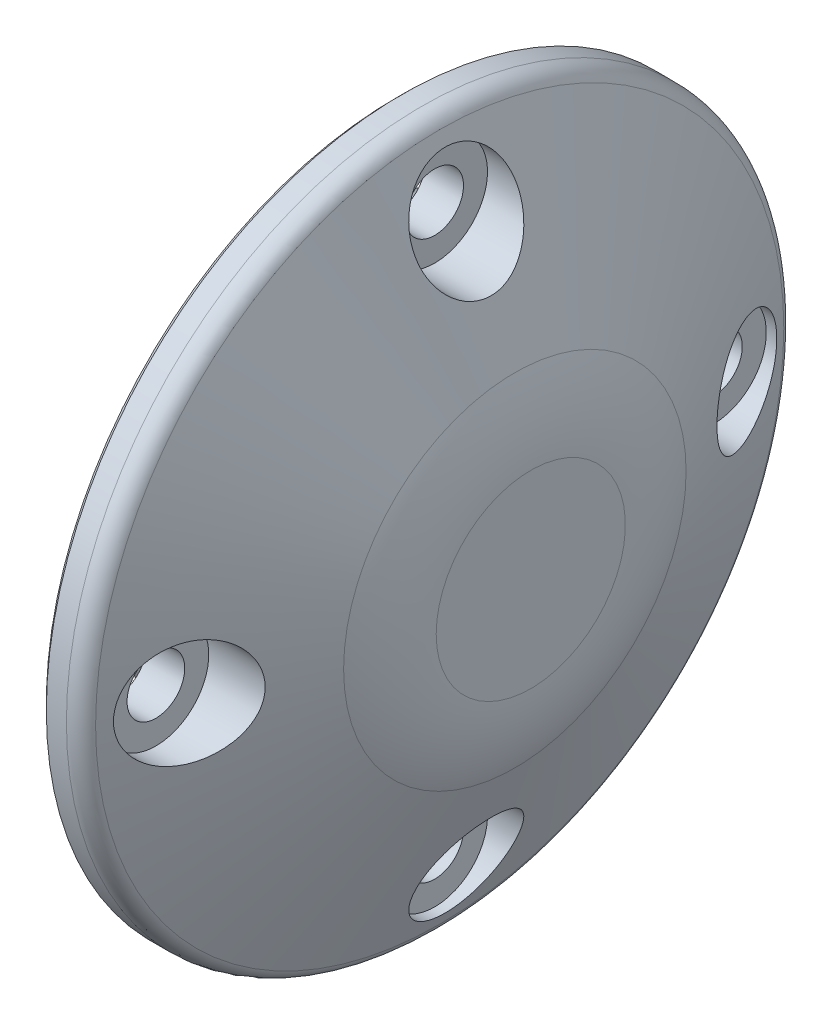
ISO-10303-21;
HEADER;
FILE_DESCRIPTION(('STEP AP214'),'2;1');
FILE_NAME('part.step','',(''),(''),'','','');
FILE_SCHEMA(('AUTOMOTIVE_DESIGN { 1 0 10303 214 1 1 1 1 }'));
ENDSEC;
DATA;
#1=APPLICATION_CONTEXT('core data for automotive mechanical design processes');
#2=APPLICATION_PROTOCOL_DEFINITION('international standard','automotive_design',2000,#1);
#3=PRODUCT_CONTEXT('',#1,'mechanical');
#4=PRODUCT('Part','Part','',(#3));
#5=PRODUCT_RELATED_PRODUCT_CATEGORY('part','',(#4));
#6=PRODUCT_DEFINITION_FORMATION('','',#4);
#7=PRODUCT_DEFINITION_CONTEXT('part definition',#1,'design');
#8=PRODUCT_DEFINITION('design','',#6,#7);
#9=PRODUCT_DEFINITION_SHAPE('','',#8);
#10=(LENGTH_UNIT() NAMED_UNIT(*) SI_UNIT(.MILLI.,.METRE.));
#11=(NAMED_UNIT(*) PLANE_ANGLE_UNIT() SI_UNIT($,.RADIAN.));
#12=(NAMED_UNIT(*) SI_UNIT($,.STERADIAN.) SOLID_ANGLE_UNIT());
#13=UNCERTAINTY_MEASURE_WITH_UNIT(LENGTH_MEASURE(1.E-05),#10,'distance_accuracy_value','');
#14=(GEOMETRIC_REPRESENTATION_CONTEXT(3) GLOBAL_UNCERTAINTY_ASSIGNED_CONTEXT((#13)) GLOBAL_UNIT_ASSIGNED_CONTEXT((#10,
#11,#12)) REPRESENTATION_CONTEXT('',''));
#15=CARTESIAN_POINT('',(0.,0.,0.));
#16=DIRECTION('',(0.,0.,1.));
#17=DIRECTION('',(1.,0.,0.));
#18=AXIS2_PLACEMENT_3D('',#15,#16,#17);
#19=CARTESIAN_POINT('',(0.,0.,0.));
#20=DIRECTION('',(-1.,0.,0.));
#21=DIRECTION('',(0.,0.,1.));
#22=AXIS2_PLACEMENT_3D('',#19,#20,#21);
#23=CYLINDRICAL_SURFACE('',#22,7.);
#24=CARTESIAN_POINT('',(-3.,0.,0.));
#25=DIRECTION('',(1.,0.,0.));
#26=DIRECTION('',(0.,0.,-1.));
#27=AXIS2_PLACEMENT_3D('',#24,#25,#26);
#28=CIRCLE('',#27,7.);
#29=CARTESIAN_POINT('',(-3.,0.,-7.));
#30=VERTEX_POINT('',#29);
#31=EDGE_CURVE('E176',#30,#30,#28,.T.);
#32=ORIENTED_EDGE('',*,*,#31,.T.);
#33=EDGE_LOOP('',(#32));
#34=FACE_BOUND('',#33,.T.);
#35=CARTESIAN_POINT('',(-10.,0.,0.));
#36=DIRECTION('',(-1.,0.,0.));
#37=DIRECTION('',(0.,0.,1.));
#38=AXIS2_PLACEMENT_3D('',#35,#36,#37);
#39=CIRCLE('',#38,7.);
#40=CARTESIAN_POINT('',(-10.,0.,7.));
#41=VERTEX_POINT('',#40);
#42=EDGE_CURVE('E181',#41,#41,#39,.T.);
#43=ORIENTED_EDGE('',*,*,#42,.T.);
#44=EDGE_LOOP('',(#43));
#45=FACE_BOUND('',#44,.T.);
#46=ADVANCED_FACE('F37',(#34,#45),#23,.F.);
#47=CARTESIAN_POINT('',(-10.,7.,0.));
#48=DIRECTION('',(1.,0.,0.));
#49=DIRECTION('',(0.,0.,-1.));
#50=AXIS2_PLACEMENT_3D('',#47,#48,#49);
#51=PLANE('',#50);
#52=CARTESIAN_POINT('',(-10.,0.,0.));
#53=DIRECTION('',(1.,0.,0.));
#54=DIRECTION('',(0.,0.,-1.));
#55=AXIS2_PLACEMENT_3D('',#52,#53,#54);
#56=CIRCLE('',#55,10.7);
#57=CARTESIAN_POINT('',(-10.,0.,-10.7));
#58=VERTEX_POINT('',#57);
#59=EDGE_CURVE('E167',#58,#58,#56,.F.);
#60=ORIENTED_EDGE('',*,*,#59,.T.);
#61=EDGE_LOOP('',(#60));
#62=FACE_BOUND('',#61,.T.);
#63=ORIENTED_EDGE('',*,*,#42,.F.);
#64=EDGE_LOOP('',(#63));
#65=FACE_BOUND('',#64,.T.);
#66=ADVANCED_FACE('F133',(#62,#65),#51,.F.);
#67=CARTESIAN_POINT('',(0.,0.,0.));
#68=DIRECTION('',(-1.,0.,0.));
#69=DIRECTION('',(0.,0.,1.));
#70=AXIS2_PLACEMENT_3D('',#67,#68,#69);
#71=CYLINDRICAL_SURFACE('',#70,11.);
#72=CARTESIAN_POINT('',(-9.7,0.,0.));
#73=DIRECTION('',(1.,0.,0.));
#74=DIRECTION('',(0.,0.,-1.));
#75=AXIS2_PLACEMENT_3D('',#72,#73,#74);
#76=CIRCLE('',#75,11.);
#77=CARTESIAN_POINT('',(-9.7,0.,-11.));
#78=VERTEX_POINT('',#77);
#79=EDGE_CURVE('E56',#78,#78,#76,.T.);
#80=ORIENTED_EDGE('',*,*,#79,.T.);
#81=EDGE_LOOP('',(#80));
#82=FACE_BOUND('',#81,.T.);
#83=CARTESIAN_POINT('',(-7.,0.,0.));
#84=DIRECTION('',(1.,0.,0.));
#85=DIRECTION('',(0.,0.,-1.));
#86=AXIS2_PLACEMENT_3D('',#83,#84,#85);
#87=CIRCLE('',#86,11.);
#88=CARTESIAN_POINT('',(-7.,0.,-11.));
#89=VERTEX_POINT('',#88);
#90=EDGE_CURVE('E171',#89,#89,#87,.F.);
#91=ORIENTED_EDGE('',*,*,#90,.T.);
#92=EDGE_LOOP('',(#91));
#93=FACE_BOUND('',#92,.T.);
#94=ADVANCED_FACE('F139',(#82,#93),#71,.T.);
#95=CARTESIAN_POINT('',(-6.,11.,0.));
#96=DIRECTION('',(1.,0.,0.));
#97=DIRECTION('',(0.,0.,-1.));
#98=AXIS2_PLACEMENT_3D('',#95,#96,#97);
#99=PLANE('',#98);
#100=CARTESIAN_POINT('',(-6.,14.5,0.));
#101=DIRECTION('',(-1.,0.,0.));
#102=DIRECTION('',(0.,0.,1.));
#103=AXIS2_PLACEMENT_3D('',#100,#101,#102);
#104=CIRCLE('',#103,1.5);
#105=CARTESIAN_POINT('',(-6.,14.5,1.5));
#106=VERTEX_POINT('',#105);
#107=EDGE_CURVE('E196',#106,#106,#104,.T.);
#108=ORIENTED_EDGE('',*,*,#107,.F.);
#109=EDGE_LOOP('',(#108));
#110=FACE_BOUND('',#109,.T.);
#111=CARTESIAN_POINT('',(-6.,4.23539569988E-13,14.5000000000004));
#112=DIRECTION('',(-1.,0.,0.));
#113=DIRECTION('',(0.,0.,1.));
#114=AXIS2_PLACEMENT_3D('',#111,#112,#113);
#115=CIRCLE('',#114,1.5);
#116=CARTESIAN_POINT('',(-6.,4.23539569988E-13,16.0000000000004));
#117=VERTEX_POINT('',#116);
#118=EDGE_CURVE('E203',#117,#117,#115,.T.);
#119=ORIENTED_EDGE('',*,*,#118,.F.);
#120=EDGE_LOOP('',(#119));
#121=FACE_BOUND('',#120,.T.);
#122=CARTESIAN_POINT('',(-6.,-14.5,8.47079139976E-13));
#123=DIRECTION('',(-1.,0.,0.));
#124=DIRECTION('',(0.,0.,1.));
#125=AXIS2_PLACEMENT_3D('',#122,#123,#124);
#126=CIRCLE('',#125,1.5);
#127=CARTESIAN_POINT('',(-6.,-14.5,1.50000000000085));
#128=VERTEX_POINT('',#127);
#129=EDGE_CURVE('E200',#128,#128,#126,.T.);
#130=ORIENTED_EDGE('',*,*,#129,.F.);
#131=EDGE_LOOP('',(#130));
#132=FACE_BOUND('',#131,.T.);
#133=CARTESIAN_POINT('',(-6.,-4.25315307846764E-13,-14.4999999999996));
#134=DIRECTION('',(-1.,0.,0.));
#135=DIRECTION('',(0.,0.,1.));
#136=AXIS2_PLACEMENT_3D('',#133,#134,#135);
#137=CIRCLE('',#136,1.5);
#138=CARTESIAN_POINT('',(-6.,-4.25315307846764E-13,-12.9999999999996));
#139=VERTEX_POINT('',#138);
#140=EDGE_CURVE('E197',#139,#139,#137,.T.);
#141=ORIENTED_EDGE('',*,*,#140,.F.);
#142=EDGE_LOOP('',(#141));
#143=FACE_BOUND('',#142,.T.);
#144=CARTESIAN_POINT('',(-6.,0.,0.));
#145=DIRECTION('',(1.,0.,0.));
#146=DIRECTION('',(0.,0.,-1.));
#147=AXIS2_PLACEMENT_3D('',#144,#145,#146);
#148=CIRCLE('',#147,18.2);
#149=CARTESIAN_POINT('',(-6.,0.,-18.2));
#150=VERTEX_POINT('',#149);
#151=EDGE_CURVE('E51',#150,#150,#148,.F.);
#152=ORIENTED_EDGE('',*,*,#151,.T.);
#153=EDGE_LOOP('',(#152));
#154=FACE_BOUND('',#153,.T.);
#155=CARTESIAN_POINT('',(-6.,0.,0.));
#156=DIRECTION('',(1.,0.,0.));
#157=DIRECTION('',(0.,0.,-1.));
#158=AXIS2_PLACEMENT_3D('',#155,#156,#157);
#159=CIRCLE('',#158,12.);
#160=CARTESIAN_POINT('',(-6.,0.,-12.));
#161=VERTEX_POINT('',#160);
#162=EDGE_CURVE('E168',#161,#161,#159,.T.);
#163=ORIENTED_EDGE('',*,*,#162,.T.);
#164=EDGE_LOOP('',(#163));
#165=FACE_BOUND('',#164,.T.);
#166=ADVANCED_FACE('F231',(#110,#121,#132,#143,#154,#165),#99,.F.);
#167=CARTESIAN_POINT('',(0.,0.,0.));
#168=DIRECTION('',(-1.,0.,0.));
#169=DIRECTION('',(0.,0.,1.));
#170=AXIS2_PLACEMENT_3D('',#167,#168,#169);
#171=CYLINDRICAL_SURFACE('',#170,18.5);
#172=CARTESIAN_POINT('',(-5.70000000000002,0.,0.));
#173=DIRECTION('',(1.,0.,0.));
#174=DIRECTION('',(0.,0.,-1.));
#175=AXIS2_PLACEMENT_3D('',#172,#173,#174);
#176=CIRCLE('',#175,18.5);
#177=CARTESIAN_POINT('',(-5.70000000000002,0.,-18.5));
#178=VERTEX_POINT('',#177);
#179=EDGE_CURVE('E10',#178,#178,#176,.T.);
#180=ORIENTED_EDGE('',*,*,#179,.T.);
#181=EDGE_LOOP('',(#180));
#182=FACE_BOUND('',#181,.T.);
#183=CARTESIAN_POINT('',(-4.65564662643343,0.,0.));
#184=DIRECTION('',(-1.,0.,0.));
#185=DIRECTION('',(0.,0.,1.));
#186=AXIS2_PLACEMENT_3D('',#183,#184,#185);
#187=CIRCLE('',#186,18.5);
#188=CARTESIAN_POINT('',(-4.65564662643343,0.,18.5));
#189=VERTEX_POINT('',#188);
#190=EDGE_CURVE('E184',#189,#189,#187,.T.);
#191=ORIENTED_EDGE('',*,*,#190,.T.);
#192=EDGE_LOOP('',(#191));
#193=FACE_BOUND('',#192,.T.);
#194=ADVANCED_FACE('F234',(#182,#193),#171,.T.);
#195=CARTESIAN_POINT('',(-4.65564662643343,0.,0.));
#196=DIRECTION('',(-1.,0.,0.));
#197=DIRECTION('',(0.,0.,1.));
#198=AXIS2_PLACEMENT_3D('',#195,#196,#197);
#199=TOROIDAL_SURFACE('',#198,17.5,0.999999999999999);
#200=ORIENTED_EDGE('',*,*,#190,.F.);
#201=EDGE_LOOP('',(#200));
#202=FACE_BOUND('',#201,.T.);
#203=CARTESIAN_POINT('',(-3.7385765701802,0.,0.));
#204=DIRECTION('',(-1.,0.,0.));
#205=DIRECTION('',(0.,0.,1.));
#206=AXIS2_PLACEMENT_3D('',#203,#204,#205);
#207=CIRCLE('',#206,17.8987261114144);
#208=CARTESIAN_POINT('',(-3.7385765701802,0.,17.8987261114144));
#209=VERTEX_POINT('',#208);
#210=EDGE_CURVE('E187',#209,#209,#207,.T.);
#211=ORIENTED_EDGE('',*,*,#210,.T.);
#212=EDGE_LOOP('',(#211));
#213=FACE_BOUND('',#212,.T.);
#214=ADVANCED_FACE('F128',(#202,#213),#199,.T.);
#215=CARTESIAN_POINT('',(0.17070056253235,0.,0.));
#216=DIRECTION('',(-1.,0.,0.));
#217=DIRECTION('',(0.,0.,1.));
#218=AXIS2_PLACEMENT_3D('',#215,#216,#217);
#219=CONICAL_SURFACE('',#218,8.90738870617559,1.16066898625341);
#220=CARTESIAN_POINT('',(-1.63010796675009,12.8610476484868,-2.20824255680728));
#221=CARTESIAN_POINT('',(-1.57165449747424,12.7400573118976,-2.11844104067019));
#222=CARTESIAN_POINT('',(-1.51548775777091,12.6256868821112,-2.01811834508152));
#223=CARTESIAN_POINT('',(-1.40990675774852,12.4135927845462,-1.79799151237397));
#224=CARTESIAN_POINT('',(-1.36049588387224,12.3158774592915,-1.67817767054178));
#225=CARTESIAN_POINT('',(-1.27069608633115,12.1403011624128,-1.42080404131312));
#226=CARTESIAN_POINT('',(-1.2303490466346,12.0625321374834,-1.28316632245381));
#227=CARTESIAN_POINT('',(-1.16157488064387,11.9310659444004,-0.994099560942523));
#228=CARTESIAN_POINT('',(-1.13313872564242,11.8773505409422,-0.842681070787273));
#229=CARTESIAN_POINT('',(-1.09216745049004,11.8002908211275,-0.543925079599131));
#230=CARTESIAN_POINT('',(-1.07850439585136,11.7747879874495,-0.397299623054259));
#231=CARTESIAN_POINT('',(-1.06407163635774,11.7478542352304,-0.101250082003507));
#232=CARTESIAN_POINT('',(-1.06329560227342,11.7464115000015,0.0481725925959655));
#233=CARTESIAN_POINT('',(-1.0742415264973,11.7668302767822,0.333414198677667));
#234=CARTESIAN_POINT('',(-1.08501512784508,11.7869234202469,0.469401739234721));
#235=CARTESIAN_POINT('',(-1.11687870842232,11.8467272098125,0.735710056453212));
#236=CARTESIAN_POINT('',(-1.13796909754057,11.8864386353535,0.8660306077396));
#237=CARTESIAN_POINT('',(-1.1896439195432,11.9846068574907,1.11987744244274));
#238=CARTESIAN_POINT('',(-1.22037729895063,12.0433582506748,1.24325860874585));
#239=CARTESIAN_POINT('',(-1.28963393469495,12.1772346542211,1.47837101883296));
#240=CARTESIAN_POINT('',(-1.32815961128904,12.252364752311,1.59009862668521));
#241=CARTESIAN_POINT('',(-1.41512401164567,12.42411333826,1.80950450976185));
#242=CARTESIAN_POINT('',(-1.46414279328872,12.522057071282,1.91591382486278));
#243=CARTESIAN_POINT('',(-1.56754021826142,12.73176581518,2.11101516053997));
#244=CARTESIAN_POINT('',(-1.62192120598543,12.843536876948,2.19969937982892));
#245=CARTESIAN_POINT('',(-1.74028614228192,13.0906141312613,2.36656759131391));
#246=CARTESIAN_POINT('',(-1.8046763490532,13.2271591241946,2.44263258262435));
#247=CARTESIAN_POINT('',(-1.93584744740343,13.5101572146572,2.57037675955239));
#248=CARTESIAN_POINT('',(-2.00262924923253,13.6566141039745,2.62204655182577));
#249=CARTESIAN_POINT('',(-2.14164028059317,13.966647498446,2.70286780032805));
#250=CARTESIAN_POINT('',(-2.21391608782391,14.1306979149761,2.73013411028564));
#251=CARTESIAN_POINT('',(-2.35722438772212,14.4615960443318,2.75473378119217));
#252=CARTESIAN_POINT('',(-2.42825666722423,14.6284442273362,2.75206205952685));
#253=CARTESIAN_POINT('',(-2.56819740009455,14.962402187595,2.71610995471977));
#254=CARTESIAN_POINT('',(-2.637065170182,15.1294860639176,2.68242392736295));
#255=CARTESIAN_POINT('',(-2.76985802473963,15.4563508000654,2.58399054991544));
#256=CARTESIAN_POINT('',(-2.83378389620299,15.616132821041,2.51924815740544));
#257=CARTESIAN_POINT('',(-2.95253160188133,15.9166944402962,2.36284487060595));
#258=CARTESIAN_POINT('',(-3.00761317621024,16.05797513128,2.27234725256631));
#259=CARTESIAN_POINT('',(-3.11003750326505,16.3233676242448,2.06545417187465));
#260=CARTESIAN_POINT('',(-3.15738348805653,16.4474865933462,1.94906957350329));
#261=CARTESIAN_POINT('',(-3.23998600089484,16.6657756932895,1.70212259174715));
#262=CARTESIAN_POINT('',(-3.27584320498476,16.7614026821969,1.5730493648872));
#263=CARTESIAN_POINT('',(-3.33849100234707,16.9294050899457,1.29859171196748));
#264=CARTESIAN_POINT('',(-3.36528564687819,17.0017908976151,1.1532146130735));
#265=CARTESIAN_POINT('',(-3.40750232889014,17.1162350408379,0.860717763057016));
#266=CARTESIAN_POINT('',(-3.42355933498126,17.1599825771937,0.714349216427872));
#267=CARTESIAN_POINT('',(-3.44653650084265,17.222672018676,0.415708088754199));
#268=CARTESIAN_POINT('',(-3.45345931508059,17.2416211304058,0.263437236213169));
#269=CARTESIAN_POINT('',(-3.45786423464912,17.2536730486467,-0.0358820046416004));
#270=CARTESIAN_POINT('',(-3.45572732096356,17.2478188926538,-0.182883942129182));
#271=CARTESIAN_POINT('',(-3.44293463064846,17.212849139122,-0.473701655928904));
#272=CARTESIAN_POINT('',(-3.4322795839971,17.1837355348472,-0.617517704176787));
#273=CARTESIAN_POINT('',(-3.40284684181527,17.103621009029,-0.897032244692326));
#274=CARTESIAN_POINT('',(-3.38412055566046,17.0527586312241,-1.0327760272243));
#275=CARTESIAN_POINT('',(-3.33905785869965,16.9310191655837,-1.29358569729923));
#276=CARTESIAN_POINT('',(-3.31272075379743,16.8601402522811,-1.41865060959564));
#277=CARTESIAN_POINT('',(-3.25224678310602,16.6985022449971,-1.65849009986135));
#278=CARTESIAN_POINT('',(-3.21790962562029,16.6072356693095,-1.77287150219107));
#279=CARTESIAN_POINT('',(-3.1427209803536,16.4090811148874,-1.9846808255013));
#280=CARTESIAN_POINT('',(-3.10186806356907,16.3021897098244,-2.08210501768699));
#281=CARTESIAN_POINT('',(-3.01217480280355,16.0698054881091,-2.26297367694604));
#282=CARTESIAN_POINT('',(-2.9630204980412,15.9436164096142,-2.34536694873621));
#283=CARTESIAN_POINT('',(-2.85959324948779,15.6811906156823,-2.48789158864544));
#284=CARTESIAN_POINT('',(-2.80531902176166,15.5449513818217,-2.54801735396937));
#285=CARTESIAN_POINT('',(-2.68904432323561,15.2568129092037,-2.64849498849779));
#286=CARTESIAN_POINT('',(-2.62677015729245,15.1044743593507,-2.68727061240312));
#287=CARTESIAN_POINT('',(-2.49906597125191,14.7966814351326,-2.7384015351951));
#288=CARTESIAN_POINT('',(-2.43363438373832,14.6412255360951,-2.75074357096587));
#289=CARTESIAN_POINT('',(-2.29711605252059,14.3219318109332,-2.74914078145914));
#290=CARTESIAN_POINT('',(-2.22592460762482,14.1581462598975,-2.73358642077653));
#291=CARTESIAN_POINT('',(-2.08348439850417,13.8360547091824,-2.67366503738857));
#292=CARTESIAN_POINT('',(-2.01223570030153,13.6777452633664,-2.62931649568393));
#293=CARTESIAN_POINT('',(-1.88816756740121,13.40681769431,-2.5265120107101));
#294=CARTESIAN_POINT('',(-1.83493852099789,13.2921791301673,-2.47378915166301));
#295=CARTESIAN_POINT('',(-1.73063042484761,13.0704646682458,-2.35263315340582));
#296=CARTESIAN_POINT('',(-1.67955115098979,12.9633879813586,-2.28420165662421));
#297=CARTESIAN_POINT('',(-1.63010796675009,12.8610476484868,-2.20824255680728));
#298=B_SPLINE_CURVE_WITH_KNOTS('',3,(#220,#221,#222,#223,#224,#225,#226,#227,#228,#229,#230,
#231,#232,#233,#234,#235,#236,#237,#238,#239,#240,#241,#242,#243,#244,#245,#246,#247,#248,#249,
#250,#251,#252,#253,#254,#255,#256,#257,#258,#259,#260,#261,#262,#263,#264,#265,#266,#267,#268,
#269,#270,#271,#272,#273,#274,#275,#276,#277,#278,#279,#280,#281,#282,#283,#284,#285,#286,#287,
#288,#289,#290,#291,#292,#293,#294,#295,#296,#297),.UNSPECIFIED.,.T.,.F.,(4,2,2,2,2,2,2,2,2,2,2,
2,2,2,2,2,2,2,2,2,2,2,2,2,2,2,2,2,2,2,2,2,2,2,2,2,2,2,4),(0.,0.48441641987448,0.969074774852527,
1.45592866177164,1.94241283214882,2.38834263918709,2.83405342930519,3.24578248179511,
3.65752789372104,4.07597527055754,4.49455281565481,4.95079413677143,5.40723582179966,
5.9122084924066,6.41737544392264,6.95884644391629,7.50040937146051,8.04915773507189,
8.59781853017919,9.12482467642546,9.65161006399119,10.1428043350302,10.633778735141,
11.0922802426048,11.5506484765721,11.989936810924,12.4291875036321,12.865680823321,
13.3022139631704,13.7511460944734,14.2001768190446,14.6736783683429,15.1472989759961,
15.6523367041615,16.1576277769035,16.6930159501966,17.2280608339517,17.6378499181515,
18.0475961760435),.UNSPECIFIED.);
#299=CARTESIAN_POINT('',(-1.63010796675009,12.8610476484868,-2.20824255680728));
#300=VERTEX_POINT('',#299);
#301=EDGE_CURVE('E42',#300,#300,#298,.T.);
#302=ORIENTED_EDGE('',*,*,#301,.T.);
#303=EDGE_LOOP('',(#302));
#304=FACE_BOUND('',#303,.T.);
#305=CARTESIAN_POINT('',(-1.63010796675022,-2.20824255680683,12.8610476484872));
#306=CARTESIAN_POINT('',(-1.69542157429301,-2.30857706924274,12.9962437572544));
#307=CARTESIAN_POINT('',(-1.76368808346081,-2.39591398365294,13.1399109224587));
#308=CARTESIAN_POINT('',(-1.90346879405526,-2.54283783276282,13.4396075512112));
#309=CARTESIAN_POINT('',(-1.97498966031418,-2.60236472170466,13.5956629210749));
#310=CARTESIAN_POINT('',(-2.11883189829615,-2.69222664163624,13.9152761467476));
#311=CARTESIAN_POINT('',(-2.1911516179402,-2.72261346125312,14.0788201493131));
#312=CARTESIAN_POINT('',(-2.33470052867798,-2.75349497311968,14.4090896073692));
#313=CARTESIAN_POINT('',(-2.40593021028018,-2.75400353091538,14.5758135512164));
#314=CARTESIAN_POINT('',(-2.54652759741976,-2.72448059510485,14.9102081626321));
#315=CARTESIAN_POINT('',(-2.61585416090552,-2.6940126663871,15.0778583239246));
#316=CARTESIAN_POINT('',(-2.74975119916233,-2.60191815772936,15.4064316436015));
#317=CARTESIAN_POINT('',(-2.8143217884915,-2.54029232857738,15.5673549639765));
#318=CARTESIAN_POINT('',(-2.93463314123753,-2.38963789960517,15.8710521466582));
#319=CARTESIAN_POINT('',(-2.99061340066946,-2.30171700244963,16.0142790620019));
#320=CARTESIAN_POINT('',(-3.09494466238922,-2.09957173237786,16.284001929821));
#321=CARTESIAN_POINT('',(-3.14329889636305,-1.98535855210376,16.4105049656902));
#322=CARTESIAN_POINT('',(-3.22796471039982,-1.74202251868677,16.6338440429372));
#323=CARTESIAN_POINT('',(-3.26486517475392,-1.61440637696193,16.7320978173151));
#324=CARTESIAN_POINT('',(-3.32963288966515,-1.34231722113908,16.9055508967094));
#325=CARTESIAN_POINT('',(-3.35750422380073,-1.19785186770421,16.9807606229538));
#326=CARTESIAN_POINT('',(-3.40178496430925,-0.906657023693622,17.100691798062));
#327=CARTESIAN_POINT('',(-3.41883622680658,-0.760725000435403,17.1471157601523));
#328=CARTESIAN_POINT('',(-3.44378389028615,-0.462440548194304,17.2151473864039));
#329=CARTESIAN_POINT('',(-3.45168303397145,-0.310090056886575,17.2367624852566));
#330=CARTESIAN_POINT('',(-3.4579464138536,-0.0103792572248741,17.2538970730002));
#331=CARTESIAN_POINT('',(-3.45670848815583,0.136911683300594,17.2505053919186));
#332=CARTESIAN_POINT('',(-3.44567248059073,0.428737082572573,17.22033014525));
#333=CARTESIAN_POINT('',(-3.4358752222309,0.573271805132416,17.1935488300185));
#334=CARTESIAN_POINT('',(-3.40811568134259,0.854329667078584,17.1179439328185));
#335=CARTESIAN_POINT('',(-3.3902208330986,0.990908662472425,17.0693024184288));
#336=CARTESIAN_POINT('',(-3.34676943556998,1.25374390346204,16.9518065088248));
#337=CARTESIAN_POINT('',(-3.32121224810554,1.37999928811117,16.8829504299925));
#338=CARTESIAN_POINT('',(-3.26230021459497,1.62235755168563,16.7252887090078));
#339=CARTESIAN_POINT('',(-3.22875497898479,1.73809827089141,16.6359984593038));
#340=CARTESIAN_POINT('',(-3.15508785026878,1.95292663644435,16.4415418702823));
#341=CARTESIAN_POINT('',(-3.11496457833958,2.05201078256622,16.3363722028434));
#342=CARTESIAN_POINT('',(-3.02674013857784,2.23644320331309,16.1073496854725));
#343=CARTESIAN_POINT('',(-2.97832724293187,2.3207746336084,15.9827988048909));
#344=CARTESIAN_POINT('',(-2.87629779822006,2.46742963854926,15.7233238565432));
#345=CARTESIAN_POINT('',(-2.82267977084286,2.52974693750444,15.5883968441229));
#346=CARTESIAN_POINT('',(-2.7076676620794,2.63495047406865,15.3026332811804));
#347=CARTESIAN_POINT('',(-2.64599376595991,2.67627654646072,15.1513348802098));
#348=CARTESIAN_POINT('',(-2.51937970855203,2.73267956134287,14.8452562274999));
#349=CARTESIAN_POINT('',(-2.45443855167875,2.74774845240803,14.6904749225049));
#350=CARTESIAN_POINT('',(-2.31874031043955,2.75190391385123,14.372049660447));
#351=CARTESIAN_POINT('',(-2.24786830186208,2.73937389080553,14.2084323494527));
#352=CARTESIAN_POINT('',(-2.10582858382064,2.685579379626,13.8860942817312));
#353=CARTESIAN_POINT('',(-2.03466080153817,2.64430734060651,13.7273748231763));
#354=CARTESIAN_POINT('',(-1.89190188011221,2.53230400065588,13.4144759261013));
#355=CARTESIAN_POINT('',(-1.82036147312941,2.46073041669903,13.2605732732101));
#356=CARTESIAN_POINT('',(-1.68152858448594,2.28944066339819,12.9670857105923));
#357=CARTESIAN_POINT('',(-1.61423643984475,2.18972226471853,12.827501936251));
#358=CARTESIAN_POINT('',(-1.48852893006075,1.96706433001308,12.5709503053061));
#359=CARTESIAN_POINT('',(-1.42992460462573,1.84481546622431,12.4534783349003));
#360=CARTESIAN_POINT('',(-1.32267630333398,1.57805829224295,12.2414159398931));
#361=CARTESIAN_POINT('',(-1.2740256124574,1.43356510482819,12.1468100812619));
#362=CARTESIAN_POINT('',(-1.19396726751354,1.14055351510228,11.9927198586654));
#363=CARTESIAN_POINT('',(-1.16138059172633,0.993644915801641,11.9307955688135));
#364=CARTESIAN_POINT('',(-1.10961466943366,0.689202566946205,11.8329820825707));
#365=CARTESIAN_POINT('',(-1.09042199818639,0.531679630288952,11.7970668161041));
#366=CARTESIAN_POINT('',(-1.06837482954484,0.229764076451265,11.7558673383358));
#367=CARTESIAN_POINT('',(-1.06392395825476,0.0858902455046679,11.7475893659931));
#368=CARTESIAN_POINT('',(-1.06715963250964,-0.201218736375698,11.7536199166474));
#369=CARTESIAN_POINT('',(-1.07484209258699,-0.344454086011419,11.7679208370051));
#370=CARTESIAN_POINT('',(-1.10112372774538,-0.619057786088168,11.8171285681938));
#371=CARTESIAN_POINT('',(-1.11917945316494,-0.750665452706855,11.8510100523769));
#372=CARTESIAN_POINT('',(-1.16467800915568,-1.00604919695447,11.9370849556017));
#373=CARTESIAN_POINT('',(-1.19212475972896,-1.12982197853759,11.9892860218382));
#374=CARTESIAN_POINT('',(-1.25647957083232,-1.37256503685203,12.1129490621493));
#375=CARTESIAN_POINT('',(-1.29377890842602,-1.49101871230276,12.1852160640328));
#376=CARTESIAN_POINT('',(-1.37532268743242,-1.71412223374909,12.3452121966572));
#377=CARTESIAN_POINT('',(-1.41956144926983,-1.81878324057926,12.4329286899026));
#378=CARTESIAN_POINT('',(-1.49226369023272,-1.96928994846526,12.5790698860081));
#379=CARTESIAN_POINT('',(-1.51891419645446,-2.02047696798171,12.6330093609876));
#380=CARTESIAN_POINT('',(-1.57355768410873,-2.11801820794354,12.7444421329776));
#381=CARTESIAN_POINT('',(-1.60155056564769,-2.16437278718521,12.8019351656399));
#382=CARTESIAN_POINT('',(-1.63010796675022,-2.20824255680683,12.8610476484872));
#383=B_SPLINE_CURVE_WITH_KNOTS('',3,(#305,#306,#307,#308,#309,#310,#311,#312,#313,#314,#315,
#316,#317,#318,#319,#320,#321,#322,#323,#324,#325,#326,#327,#328,#329,#330,#331,#332,#333,#334,
#335,#336,#337,#338,#339,#340,#341,#342,#343,#344,#345,#346,#347,#348,#349,#350,#351,#352,#353,
#354,#355,#356,#357,#358,#359,#360,#361,#362,#363,#364,#365,#366,#367,#368,#369,#370,#371,#372,
#373,#374,#375,#376,#377,#378,#379,#380,#381,#382),.UNSPECIFIED.,.T.,.F.,(4,2,2,2,2,2,2,2,2,2,2,
2,2,2,2,2,2,2,2,2,2,2,2,2,2,2,2,2,2,2,2,2,2,2,2,2,2,2,4),(0.,0.54145626030637,1.0840762585843,
1.62573009883039,2.16713257286066,2.71627016310786,3.2653945218386,3.79403928902329,
4.32245942658837,4.8155618581291,5.30844096331051,5.76835956123389,6.22814029526909,
6.66802360701459,7.10786460152126,7.54410828689308,7.98038831616564,8.42834494021087,
8.87639558085654,9.34838694454308,9.82051275304539,10.3239056908789,10.8274529604979,
11.3612747798501,11.8952368937753,12.4451318107813,12.9950702968985,13.5303335244298,
14.065234447919,14.5506370254013,15.035552384914,15.4658648708595,15.8960324952746,
16.3054875985505,16.7151138255271,17.1444244084453,17.5733854377882,17.8101467062003,
18.0468903831579),.UNSPECIFIED.);
#384=CARTESIAN_POINT('',(-1.63010796675022,-2.20824255680683,12.8610476484872));
#385=VERTEX_POINT('',#384);
#386=EDGE_CURVE('E379',#385,#385,#383,.T.);
#387=ORIENTED_EDGE('',*,*,#386,.T.);
#388=EDGE_LOOP('',(#387));
#389=FACE_BOUND('',#388,.T.);
#390=CARTESIAN_POINT('',(-3.12919695812886,-16.373915766461,-2.01269463660217));
#391=CARTESIAN_POINT('',(-3.17047300193534,-16.4819262448904,-1.91212641403767));
#392=CARTESIAN_POINT('',(-3.20856056809315,-16.5825272436474,-1.80219033415802));
#393=CARTESIAN_POINT('',(-3.27740241951614,-16.7655281050419,-1.56595673713005));
#394=CARTESIAN_POINT('',(-3.30815307626196,-16.8479189602495,-1.43965117179266));
#395=CARTESIAN_POINT('',(-3.3615245673234,-16.9915836678841,-1.17362538409109));
#396=CARTESIAN_POINT('',(-3.38413020955035,-17.0528180505884,-1.03388070359352));
#397=CARTESIAN_POINT('',(-3.42046262687251,-17.1515112892231,-0.745151653588798));
#398=CARTESIAN_POINT('',(-3.43419160960268,-17.1889760566394,-0.596169591537419));
#399=CARTESIAN_POINT('',(-3.45204214847196,-17.2377325490718,-0.298739003687355));
#400=CARTESIAN_POINT('',(-3.45647943767964,-17.2498843342664,-0.150450092874345));
#401=CARTESIAN_POINT('',(-3.45656342297703,-17.2501139758509,0.146138439632937));
#402=CARTESIAN_POINT('',(-3.45221123503733,-17.2381948884393,0.294438057577174));
#403=CARTESIAN_POINT('',(-3.43501778472076,-17.1912321822971,0.583815758280064));
#404=CARTESIAN_POINT('',(-3.42234391185869,-17.1566445626055,0.724978302787475));
#405=CARTESIAN_POINT('',(-3.38902461681734,-17.0660946174399,0.999259342503919));
#406=CARTESIAN_POINT('',(-3.36837897589579,-17.0101317054364,1.13237761686531));
#407=CARTESIAN_POINT('',(-3.3192647564132,-16.8777617181867,1.38922965806144));
#408=CARTESIAN_POINT('',(-3.29067554199149,-16.8010398987785,1.5127777559267));
#409=CARTESIAN_POINT('',(-3.22654830731745,-16.6302053773155,1.74514570961879));
#410=CARTESIAN_POINT('',(-3.19100907307643,-16.5360896371507,1.85396298672475));
#411=CARTESIAN_POINT('',(-3.11202208421716,-16.3287296371601,2.05924732035983));
#412=CARTESIAN_POINT('',(-3.0682851652646,-16.2148033203664,2.15491324099765));
#413=CARTESIAN_POINT('',(-2.97512116712867,-15.9746664509021,2.3258548390898));
#414=CARTESIAN_POINT('',(-2.9256925754955,-15.8484526344541,2.40112507889393));
#415=CARTESIAN_POINT('',(-2.8188783222691,-15.5788910344523,2.53426635027552));
#416=CARTESIAN_POINT('',(-2.76118599107048,-15.4349637233984,2.59071756621556));
#417=CARTESIAN_POINT('',(-2.64182541032215,-15.1412457743006,2.67858633767344));
#418=CARTESIAN_POINT('',(-2.58015594728939,-14.9914533522518,2.70999621326558));
#419=CARTESIAN_POINT('',(-2.45007587925953,-14.6801095927931,2.74885881524167));
#420=CARTESIAN_POINT('',(-2.38148699832488,-14.5184227756041,2.75463638706395));
#421=CARTESIAN_POINT('',(-2.24290909216424,-14.197097687858,2.73800154049313));
#422=CARTESIAN_POINT('',(-2.17291967652134,-14.0374600094691,2.71558115071905));
#423=CARTESIAN_POINT('',(-2.03032034177154,-13.7176917398952,2.64169418349121));
#424=CARTESIAN_POINT('',(-1.95772549739678,-13.5578286544697,2.58903341368705));
#425=CARTESIAN_POINT('',(-1.81513193909212,-13.2493427228779,2.45492362754793));
#426=CARTESIAN_POINT('',(-1.74513369247575,-13.1007218950438,2.3734694567301));
#427=CARTESIAN_POINT('',(-1.61072976896287,-12.8201867673797,2.18385405337104));
#428=CARTESIAN_POINT('',(-1.54629312635435,-12.6881777977913,2.07585558923885));
#429=CARTESIAN_POINT('',(-1.42555470885658,-12.4446143338751,1.83498873534688));
#430=CARTESIAN_POINT('',(-1.36924986626893,-12.3330521217711,1.70212976779141));
#431=CARTESIAN_POINT('',(-1.27189804385573,-12.1425997285702,1.42523893681441));
#432=CARTESIAN_POINT('',(-1.23003732700912,-12.0619190937648,1.2827305331943));
#433=CARTESIAN_POINT('',(-1.15914661153854,-11.9264422068896,0.982987388853812));
#434=CARTESIAN_POINT('',(-1.13010295293353,-11.8716183932013,0.825768543743724));
#435=CARTESIAN_POINT('',(-1.0897240772171,-11.7957186372959,0.520733533266993));
#436=CARTESIAN_POINT('',(-1.07673489953026,-11.7714836829923,0.373919146753465));
#437=CARTESIAN_POINT('',(-1.06366286078729,-11.7470943000354,0.0777585130651895));
#438=CARTESIAN_POINT('',(-1.06357322176288,-11.7469272250906,-0.0715863632227393));
#439=CARTESIAN_POINT('',(-1.07579935318489,-11.7697381198409,-0.35639213942662));
#440=CARTESIAN_POINT('',(-1.08716691558639,-11.7909469960076,-0.492041363355581));
#441=CARTESIAN_POINT('',(-1.12014350619944,-11.8528723105778,-0.757489900706717));
#442=CARTESIAN_POINT('',(-1.14175302806577,-11.8935896892776,-0.887288931823705));
#443=CARTESIAN_POINT('',(-1.19444761579558,-11.9937769660915,-1.14026798762188));
#444=CARTESIAN_POINT('',(-1.22570352870281,-12.0535857052401,-1.26327724128519));
#445=CARTESIAN_POINT('',(-1.29594020626547,-12.1895055512249,-1.49748700372225));
#446=CARTESIAN_POINT('',(-1.33492343339249,-12.2656218554372,-1.60868373079106));
#447=CARTESIAN_POINT('',(-1.42282340315693,-12.4394485640142,-1.82697156888561));
#448=CARTESIAN_POINT('',(-1.47232194582746,-12.5384955418138,-1.93276247593414));
#449=CARTESIAN_POINT('',(-1.57660632434147,-12.7503311859194,-2.12644840338959));
#450=CARTESIAN_POINT('',(-1.63139448564923,-12.8631259018865,-2.2143354994906));
#451=CARTESIAN_POINT('',(-1.7505198149134,-13.1122181873998,-2.37932102738971));
#452=CARTESIAN_POINT('',(-1.81525360944076,-13.2497397042472,-2.45428881216628));
#453=CARTESIAN_POINT('',(-1.94701708984029,-13.5345386150274,-2.5796537229088));
#454=CARTESIAN_POINT('',(-2.01404756078602,-13.6818193613561,-2.63004235546204));
#455=CARTESIAN_POINT('',(-2.15337233435507,-13.993143001481,-2.70797153178892));
#456=CARTESIAN_POINT('',(-2.22570534854794,-14.1576363377128,-2.73365636096964));
#457=CARTESIAN_POINT('',(-2.36904124455259,-14.4892152428415,-2.75499431090623));
#458=CARTESIAN_POINT('',(-2.44004358809992,-14.6563018128029,-2.75063553098307));
#459=CARTESIAN_POINT('',(-2.57972901001865,-14.9902460841531,-2.71123044820974));
#460=CARTESIAN_POINT('',(-2.64837368655768,-15.1570766130984,-2.67581389430257));
#461=CARTESIAN_POINT('',(-2.78056205786744,-15.4829876732334,-2.57396603492531));
#462=CARTESIAN_POINT('',(-2.84411244747287,-15.6420782642792,-2.50757624385639));
#463=CARTESIAN_POINT('',(-2.94526173052934,-15.898458474111,-2.37080982133367));
#464=CARTESIAN_POINT('',(-2.98469495684439,-15.9993353242335,-2.30838828331597));
#465=CARTESIAN_POINT('',(-3.05985558371743,-16.1930838465786,-2.17027891134656));
#466=CARTESIAN_POINT('',(-3.0955835333064,-16.2859567044505,-2.09459304732558));
#467=CARTESIAN_POINT('',(-3.12919695812886,-16.373915766461,-2.01269463660217));
#468=B_SPLINE_CURVE_WITH_KNOTS('',3,(#390,#391,#392,#393,#394,#395,#396,#397,#398,#399,#400,
#401,#402,#403,#404,#405,#406,#407,#408,#409,#410,#411,#412,#413,#414,#415,#416,#417,#418,#419,
#420,#421,#422,#423,#424,#425,#426,#427,#428,#429,#430,#431,#432,#433,#434,#435,#436,#437,#438,
#439,#440,#441,#442,#443,#444,#445,#446,#447,#448,#449,#450,#451,#452,#453,#454,#455,#456,#457,
#458,#459,#460,#461,#462,#463,#464,#465,#466,#467),.UNSPECIFIED.,.T.,.F.,(4,2,2,2,2,2,2,2,2,2,2,
2,2,2,2,2,2,2,2,2,2,2,2,2,2,2,2,2,2,2,2,2,2,2,2,2,2,2,4),(0.,0.459316092867421,
0.918858875009426,1.37925441305117,1.83953540612982,2.2839038669442,2.72821591132503,
3.16385372920259,3.59950350166558,4.04216955558692,4.4849130009943,4.94807742441427,
5.41136520991478,5.90426843599821,6.39732277242317,6.92216583142224,7.4471572935069,
7.99446526831909,8.54187126973905,9.08600086949572,9.629924658702,10.1341449833442,
10.6378266217543,11.083512126711,11.5289634486219,11.9403478524891,12.3517520867935,
12.7709070818528,13.1901958648511,13.6477392501462,14.1054847082708,14.611744170718,
15.1181784491975,15.6602229888197,16.202482251935,16.7512952312116,17.2993747232905,
17.6734773954483,18.0475245553392),.UNSPECIFIED.);
#469=CARTESIAN_POINT('',(-3.12919695812886,-16.373915766461,-2.01269463660217));
#470=VERTEX_POINT('',#469);
#471=EDGE_CURVE('E80',#470,#470,#468,.T.);
#472=ORIENTED_EDGE('',*,*,#471,.T.);
#473=EDGE_LOOP('',(#472));
#474=FACE_BOUND('',#473,.T.);
#475=CARTESIAN_POINT('',(-3.12919695812875,-2.01269463660342,-16.3739157664607));
#476=CARTESIAN_POINT('',(-3.08384083610348,-2.12318560247025,-16.2552293516161));
#477=CARTESIAN_POINT('',(-3.03456312235087,-2.22252729348605,-16.1274102884748));
#478=CARTESIAN_POINT('',(-2.92951674342979,-2.39660125540047,-15.8581636573855));
#479=CARTESIAN_POINT('',(-2.87373474567124,-2.47128173133321,-15.7167082439501));
#480=CARTESIAN_POINT('',(-2.75729395256118,-2.59444992223374,-15.4253382474656));
#481=CARTESIAN_POINT('',(-2.69665167598882,-2.64302236725488,-15.2754527940338));
#482=CARTESIAN_POINT('',(-2.57174627651247,-2.71383866489899,-14.9711585625928));
#483=CARTESIAN_POINT('',(-2.50748431838574,-2.73609093695512,-14.8167512472653));
#484=CARTESIAN_POINT('',(-2.37333785955965,-2.754823831166,-14.4993473332045));
#485=CARTESIAN_POINT('',(-2.30333432987446,-2.74991558594396,-14.3363185944395));
#486=CARTESIAN_POINT('',(-2.16255126517598,-2.71157235389777,-14.0139510810422));
#487=CARTESIAN_POINT('',(-2.09177146080027,-2.67812713452013,-13.854613651062));
#488=CARTESIAN_POINT('',(-1.94881011757474,-2.581841095837,-13.5382872687071));
#489=CARTESIAN_POINT('',(-1.87666860486416,-2.51799451607673,-13.3815847042729));
#490=CARTESIAN_POINT('',(-1.73593278721779,-2.36183146789962,-13.0812321397739));
#491=CARTESIAN_POINT('',(-1.66733891589164,-2.2695115288904,-12.9375837336336));
#492=CARTESIAN_POINT('',(-1.53766208193193,-2.0600290263559,-12.6705011734724));
#493=CARTESIAN_POINT('',(-1.47646649451544,-1.94334160446498,-12.5467507405613));
#494=CARTESIAN_POINT('',(-1.36330136902072,-1.68654680282241,-12.3211904260791));
#495=CARTESIAN_POINT('',(-1.31132670804131,-1.54645251184643,-12.2193683549254));
#496=CARTESIAN_POINT('',(-1.22392370579824,-1.25925605229314,-12.050069679605));
#497=CARTESIAN_POINT('',(-1.18746507778535,-1.11375920443407,-11.980410774766));
#498=CARTESIAN_POINT('',(-1.12778785066281,-0.810441892945668,-11.867167436873));
#499=CARTESIAN_POINT('',(-1.10455536448946,-0.652634553728777,-11.8235556527287));
#500=CARTESIAN_POINT('',(-1.0750813863044,-0.34888796855259,-11.7683671525813));
#501=CARTESIAN_POINT('',(-1.06719503216573,-0.203667013871948,-11.7536866694368));
#502=CARTESIAN_POINT('',(-1.06389932071879,0.0873859971864353,-11.7475426729797));
#503=CARTESIAN_POINT('',(-1.06848523423964,0.23321780100894,-11.7560703597124));
#504=CARTESIAN_POINT('',(-1.08912950679812,0.512085063363498,-11.7946547098557));
#505=CARTESIAN_POINT('',(-1.10447880826325,0.645361646826365,-11.8233810537244));
#506=CARTESIAN_POINT('',(-1.14490690954041,0.904854531194101,-11.8996093951361));
#507=CARTESIAN_POINT('',(-1.16998678462306,1.0310700500564,-11.9471134677105));
#508=CARTESIAN_POINT('',(-1.2295698126551,1.27801806036106,-12.0610796529174));
#509=CARTESIAN_POINT('',(-1.26438143320861,1.39838626342292,-12.1281662250093));
#510=CARTESIAN_POINT('',(-1.34128488278488,1.62621506406811,-12.2781656521356));
#511=CARTESIAN_POINT('',(-1.38337929268608,1.73367106286457,-12.3610841187673));
#512=CARTESIAN_POINT('',(-1.47761771453646,1.9438935004527,-12.5492100986637));
#513=CARTESIAN_POINT('',(-1.53034337169668,2.04515294534956,-12.6558091636372));
#514=CARTESIAN_POINT('',(-1.64057138226409,2.22853591833173,-12.8821706867768));
#515=CARTESIAN_POINT('',(-1.69807583201428,2.31065098748357,-13.0019389294725));
#516=CARTESIAN_POINT('',(-1.82216766062117,2.46199100479316,-13.2645461047152));
#517=CARTESIAN_POINT('',(-1.88908197370526,2.52903298480608,-13.4084915171327));
#518=CARTESIAN_POINT('',(-2.02455995846597,2.63733050575754,-13.7050598893412));
#519=CARTESIAN_POINT('',(-2.09312420234016,2.67857696294421,-13.8576858853349));
#520=CARTESIAN_POINT('',(-2.23424628217393,2.73608489805532,-14.177158726456));
#521=CARTESIAN_POINT('',(-2.30679652157205,2.75069610129699,-14.3443090000185));
#522=CARTESIAN_POINT('',(-2.44982448944729,2.74925279944323,-14.6793994399134));
#523=CARTESIAN_POINT('',(-2.52030200150331,2.73319510355657,-14.8473396866212));
#524=CARTESIAN_POINT('',(-2.65740798166135,2.67017855318736,-15.1790876734862));
#525=CARTESIAN_POINT('',(-2.72403464092745,2.62320530322369,-15.342893451561));
#526=CARTESIAN_POINT('',(-2.85163134041163,2.49878932477889,-15.6608957191986));
#527=CARTESIAN_POINT('',(-2.91260268293612,2.42135363282412,-15.815094418381));
#528=CARTESIAN_POINT('',(-3.02440494624147,2.24185848223053,-16.1011568094899));
#529=CARTESIAN_POINT('',(-3.07558223177128,2.14116014282037,-16.2337374879743));
#530=CARTESIAN_POINT('',(-3.1697815932349,1.91569342831948,-16.480012521584));
#531=CARTESIAN_POINT('',(-3.21280728335822,1.7909357702014,-16.5937152438888));
#532=CARTESIAN_POINT('',(-3.2866850391511,1.53026291301767,-16.7903212599587));
#533=CARTESIAN_POINT('',(-3.31817651530799,1.39573116205054,-16.8748187301138));
#534=CARTESIAN_POINT('',(-3.37198972402246,1.11265205373642,-17.0198736676354));
#535=CARTESIAN_POINT('',(-3.39431531374127,0.964110624328687,-17.0804412047208));
#536=CARTESIAN_POINT('',(-3.42799639958239,0.667283944799405,-17.1720486514083));
#537=CARTESIAN_POINT('',(-3.43994935111917,0.519560763355758,-17.204694852387));
#538=CARTESIAN_POINT('',(-3.45481153070103,0.220331014976534,-17.2453106674749));
#539=CARTESIAN_POINT('',(-3.45772342049759,0.068825574808046,-17.2532875444019));
#540=CARTESIAN_POINT('',(-3.45447800015565,-0.228089428064798,-17.2444084667939));
#541=CARTESIAN_POINT('',(-3.44863055477779,-0.373528750995196,-17.2284009641107));
#542=CARTESIAN_POINT('',(-3.42859512357576,-0.659517647736874,-17.1737111354905));
#543=CARTESIAN_POINT('',(-3.41440514058776,-0.8000660421466,-17.1350233800152));
#544=CARTESIAN_POINT('',(-3.37804189068755,-1.07267074609109,-17.0363262582992));
#545=CARTESIAN_POINT('',(-3.35585154534001,-1.2047081709583,-16.9762712829217));
#546=CARTESIAN_POINT('',(-3.30408962586487,-1.45651693276044,-16.8370312236437));
#547=CARTESIAN_POINT('',(-3.27452691622196,-1.57630275877358,-16.7578691176843));
#548=CARTESIAN_POINT('',(-3.22462592456937,-1.74679824867144,-16.6252417094928));
#549=CARTESIAN_POINT('',(-3.20670079955991,-1.80299466408494,-16.577758706566));
#550=CARTESIAN_POINT('',(-3.16918011910796,-1.91110957513585,-16.4787705611843));
#551=CARTESIAN_POINT('',(-3.14958472531001,-1.96302848378572,-16.4272658079849));
#552=CARTESIAN_POINT('',(-3.12919695812875,-2.01269463660342,-16.3739157664607));
#553=B_SPLINE_CURVE_WITH_KNOTS('',3,(#475,#476,#477,#478,#479,#480,#481,#482,#483,#484,#485,
#486,#487,#488,#489,#490,#491,#492,#493,#494,#495,#496,#497,#498,#499,#500,#501,#502,#503,#504,
#505,#506,#507,#508,#509,#510,#511,#512,#513,#514,#515,#516,#517,#518,#519,#520,#521,#522,#523,
#524,#525,#526,#527,#528,#529,#530,#531,#532,#533,#534,#535,#536,#537,#538,#539,#540,#541,#542,
#543,#544,#545,#546,#547,#548,#549,#550,#551,#552),.UNSPECIFIED.,.T.,.F.,(4,2,2,2,2,2,2,2,2,2,2,
2,2,2,2,2,2,2,2,2,2,2,2,2,2,2,2,2,2,2,2,2,2,2,2,2,2,2,4),(0.,0.504845520042367,1.01074470143688,
1.51499198818425,2.01907793003871,2.54917115468566,3.07945453571846,3.62864867600202,
4.17790978354269,4.71732197784518,5.25643354417243,5.74976489597763,6.24257730434353,
6.67879464412973,7.114846604311,7.52458308154007,7.93436484932937,8.3589920631362,
8.78377006593024,9.25042987255531,9.71729548346437,10.2319992572537,10.7468841792472,
11.2927084371054,11.8385894855948,12.3847248974782,12.9307342314233,13.4505220613661,
13.9700788898144,14.4534283664106,14.9365742323067,15.3895805294546,15.8424534457437,
16.279679611303,16.7170104893731,17.1552805230194,17.5930261031083,17.8199782218734,
18.0469084016491),.UNSPECIFIED.);
#554=CARTESIAN_POINT('',(-3.12919695812875,-2.01269463660342,-16.3739157664607));
#555=VERTEX_POINT('',#554);
#556=EDGE_CURVE('E73',#555,#555,#553,.T.);
#557=ORIENTED_EDGE('',*,*,#556,.T.);
#558=EDGE_LOOP('',(#557));
#559=FACE_BOUND('',#558,.T.);
#560=ORIENTED_EDGE('',*,*,#210,.F.);
#561=EDGE_LOOP('',(#560));
#562=FACE_BOUND('',#561,.T.);
#563=CARTESIAN_POINT('',(0.17070056253235,0.,0.));
#564=DIRECTION('',(-1.,0.,0.));
#565=DIRECTION('',(0.,0.,1.));
#566=AXIS2_PLACEMENT_3D('',#563,#564,#565);
#567=CIRCLE('',#566,8.90738870617559);
#568=CARTESIAN_POINT('',(0.17070056253235,0.,8.90738870617559));
#569=VERTEX_POINT('',#568);
#570=EDGE_CURVE('E190',#569,#569,#567,.T.);
#571=ORIENTED_EDGE('',*,*,#570,.T.);
#572=EDGE_LOOP('',(#571));
#573=FACE_BOUND('',#572,.T.);
#574=ADVANCED_FACE('F85',(#304,#389,#474,#559,#562,#573),#219,.T.);
#575=CARTESIAN_POINT('',(-9.,0.,0.));
#576=DIRECTION('',(-1.,0.,0.));
#577=DIRECTION('',(0.,0.,1.));
#578=AXIS2_PLACEMENT_3D('',#575,#576,#577);
#579=DEGENERATE_TOROIDAL_SURFACE('',#578,4.92012759203109,10.,.T.);
#580=ORIENTED_EDGE('',*,*,#570,.F.);
#581=EDGE_LOOP('',(#580));
#582=FACE_BOUND('',#581,.T.);
#583=CARTESIAN_POINT('',(1.,0.,0.));
#584=DIRECTION('',(-1.,0.,0.));
#585=DIRECTION('',(0.,0.,1.));
#586=AXIS2_PLACEMENT_3D('',#583,#584,#585);
#587=CIRCLE('',#586,4.92012759203109);
#588=CARTESIAN_POINT('',(1.,0.,4.92012759203109));
#589=VERTEX_POINT('',#588);
#590=EDGE_CURVE('E193',#589,#589,#587,.T.);
#591=ORIENTED_EDGE('',*,*,#590,.T.);
#592=EDGE_LOOP('',(#591));
#593=FACE_BOUND('',#592,.T.);
#594=ADVANCED_FACE('F121',(#582,#593),#579,.T.);
#595=CARTESIAN_POINT('',(1.,4.92012759203109,0.));
#596=DIRECTION('',(-1.,0.,0.));
#597=DIRECTION('',(0.,0.,1.));
#598=AXIS2_PLACEMENT_3D('',#595,#596,#597);
#599=PLANE('',#598);
#600=ORIENTED_EDGE('',*,*,#590,.F.);
#601=EDGE_LOOP('',(#600));
#602=FACE_BOUND('',#601,.T.);
#603=ADVANCED_FACE('F118',(#602),#599,.F.);
#604=CARTESIAN_POINT('',(-2.,7.,0.));
#605=DIRECTION('',(1.,0.,0.));
#606=DIRECTION('',(0.,0.,-1.));
#607=AXIS2_PLACEMENT_3D('',#604,#605,#606);
#608=PLANE('',#607);
#609=CARTESIAN_POINT('',(-2.,0.,0.));
#610=DIRECTION('',(1.,0.,0.));
#611=DIRECTION('',(0.,0.,-1.));
#612=AXIS2_PLACEMENT_3D('',#609,#610,#611);
#613=CIRCLE('',#612,6.);
#614=CARTESIAN_POINT('',(-2.,0.,-6.));
#615=VERTEX_POINT('',#614);
#616=EDGE_CURVE('E178',#615,#615,#613,.F.);
#617=ORIENTED_EDGE('',*,*,#616,.T.);
#618=EDGE_LOOP('',(#617));
#619=FACE_BOUND('',#618,.T.);
#620=ADVANCED_FACE('F114',(#619),#608,.F.);
#621=CARTESIAN_POINT('',(-3.,0.,0.));
#622=DIRECTION('',(1.,0.,0.));
#623=DIRECTION('',(0.,0.,-1.));
#624=AXIS2_PLACEMENT_3D('',#621,#622,#623);
#625=TOROIDAL_SURFACE('',#624,6.,1.);
#626=ORIENTED_EDGE('',*,*,#31,.F.);
#627=EDGE_LOOP('',(#626));
#628=FACE_BOUND('',#627,.T.);
#629=ORIENTED_EDGE('',*,*,#616,.F.);
#630=EDGE_LOOP('',(#629));
#631=FACE_BOUND('',#630,.T.);
#632=ADVANCED_FACE('F117',(#628,#631),#625,.F.);
#633=CARTESIAN_POINT('',(-7.,0.,0.));
#634=DIRECTION('',(1.,0.,0.));
#635=DIRECTION('',(0.,0.,-1.));
#636=AXIS2_PLACEMENT_3D('',#633,#634,#635);
#637=TOROIDAL_SURFACE('',#636,12.,1.);
#638=ORIENTED_EDGE('',*,*,#162,.F.);
#639=EDGE_LOOP('',(#638));
#640=FACE_BOUND('',#639,.T.);
#641=ORIENTED_EDGE('',*,*,#90,.F.);
#642=EDGE_LOOP('',(#641));
#643=FACE_BOUND('',#642,.T.);
#644=ADVANCED_FACE('F148',(#640,#643),#637,.F.);
#645=CARTESIAN_POINT('',(-10.,0.,0.));
#646=DIRECTION('',(1.,0.,0.));
#647=DIRECTION('',(0.,0.,-1.));
#648=AXIS2_PLACEMENT_3D('',#645,#646,#647);
#649=CONICAL_SURFACE('',#648,10.7,0.785398163397448);
#650=ORIENTED_EDGE('',*,*,#79,.F.);
#651=EDGE_LOOP('',(#650));
#652=FACE_BOUND('',#651,.T.);
#653=ORIENTED_EDGE('',*,*,#59,.F.);
#654=EDGE_LOOP('',(#653));
#655=FACE_BOUND('',#654,.T.);
#656=ADVANCED_FACE('F151',(#652,#655),#649,.T.);
#657=CARTESIAN_POINT('',(-6.,0.,0.));
#658=DIRECTION('',(1.,0.,0.));
#659=DIRECTION('',(0.,0.,-1.));
#660=AXIS2_PLACEMENT_3D('',#657,#658,#659);
#661=CONICAL_SURFACE('',#660,18.2,0.785398163397443);
#662=ORIENTED_EDGE('',*,*,#179,.F.);
#663=EDGE_LOOP('',(#662));
#664=FACE_BOUND('',#663,.T.);
#665=ORIENTED_EDGE('',*,*,#151,.F.);
#666=EDGE_LOOP('',(#665));
#667=FACE_BOUND('',#666,.T.);
#668=ADVANCED_FACE('F40',(#664,#667),#661,.T.);
#669=CARTESIAN_POINT('',(4.,-4.25315307846764E-13,-14.4999999999996));
#670=DIRECTION('',(-1.,0.,0.));
#671=DIRECTION('',(0.,0.,1.));
#672=AXIS2_PLACEMENT_3D('',#669,#670,#671);
#673=CYLINDRICAL_SURFACE('',#672,1.5);
#674=CARTESIAN_POINT('',(-4.,-4.25315307846764E-13,-14.4999999999996));
#675=DIRECTION('',(-1.,0.,0.));
#676=DIRECTION('',(0.,0.,1.));
#677=AXIS2_PLACEMENT_3D('',#674,#675,#676);
#678=CIRCLE('',#677,1.5);
#679=CARTESIAN_POINT('',(-4.,-4.25315307846764E-13,-12.9999999999996));
#680=VERTEX_POINT('',#679);
#681=EDGE_CURVE('E70',#680,#680,#678,.F.);
#682=ORIENTED_EDGE('',*,*,#681,.T.);
#683=EDGE_LOOP('',(#682));
#684=FACE_BOUND('',#683,.T.);
#685=ORIENTED_EDGE('',*,*,#140,.T.);
#686=EDGE_LOOP('',(#685));
#687=FACE_BOUND('',#686,.T.);
#688=ADVANCED_FACE('F109',(#684,#687),#673,.F.);
#689=CARTESIAN_POINT('',(4.,-14.5,8.47079139976E-13));
#690=DIRECTION('',(-1.,0.,0.));
#691=DIRECTION('',(0.,0.,1.));
#692=AXIS2_PLACEMENT_3D('',#689,#690,#691);
#693=CYLINDRICAL_SURFACE('',#692,1.5);
#694=CARTESIAN_POINT('',(-4.,-14.5,8.47079139976E-13));
#695=DIRECTION('',(-1.,0.,0.));
#696=DIRECTION('',(0.,0.,1.));
#697=AXIS2_PLACEMENT_3D('',#694,#695,#696);
#698=CIRCLE('',#697,1.5);
#699=CARTESIAN_POINT('',(-4.,-14.5,1.50000000000085));
#700=VERTEX_POINT('',#699);
#701=EDGE_CURVE('E67',#700,#700,#698,.F.);
#702=ORIENTED_EDGE('',*,*,#701,.T.);
#703=EDGE_LOOP('',(#702));
#704=FACE_BOUND('',#703,.T.);
#705=ORIENTED_EDGE('',*,*,#129,.T.);
#706=EDGE_LOOP('',(#705));
#707=FACE_BOUND('',#706,.T.);
#708=ADVANCED_FACE('F105',(#704,#707),#693,.F.);
#709=CARTESIAN_POINT('',(4.,4.23539569988E-13,14.5000000000004));
#710=DIRECTION('',(-1.,0.,0.));
#711=DIRECTION('',(0.,0.,1.));
#712=AXIS2_PLACEMENT_3D('',#709,#710,#711);
#713=CYLINDRICAL_SURFACE('',#712,1.5);
#714=CARTESIAN_POINT('',(-4.,4.23539569988E-13,14.5000000000004));
#715=DIRECTION('',(-1.,0.,0.));
#716=DIRECTION('',(0.,0.,1.));
#717=AXIS2_PLACEMENT_3D('',#714,#715,#716);
#718=CIRCLE('',#717,1.5);
#719=CARTESIAN_POINT('',(-4.,4.23539569988E-13,16.0000000000004));
#720=VERTEX_POINT('',#719);
#721=EDGE_CURVE('E63',#720,#720,#718,.F.);
#722=ORIENTED_EDGE('',*,*,#721,.T.);
#723=EDGE_LOOP('',(#722));
#724=FACE_BOUND('',#723,.T.);
#725=ORIENTED_EDGE('',*,*,#118,.T.);
#726=EDGE_LOOP('',(#725));
#727=FACE_BOUND('',#726,.T.);
#728=ADVANCED_FACE('F101',(#724,#727),#713,.F.);
#729=CARTESIAN_POINT('',(4.,14.5,0.));
#730=DIRECTION('',(-1.,0.,0.));
#731=DIRECTION('',(0.,0.,1.));
#732=AXIS2_PLACEMENT_3D('',#729,#730,#731);
#733=CYLINDRICAL_SURFACE('',#732,1.5);
#734=CARTESIAN_POINT('',(-4.,14.5,0.));
#735=DIRECTION('',(-1.,0.,0.));
#736=DIRECTION('',(0.,0.,1.));
#737=AXIS2_PLACEMENT_3D('',#734,#735,#736);
#738=CIRCLE('',#737,1.5);
#739=CARTESIAN_POINT('',(-4.,14.5,1.5));
#740=VERTEX_POINT('',#739);
#741=EDGE_CURVE('E60',#740,#740,#738,.F.);
#742=ORIENTED_EDGE('',*,*,#741,.T.);
#743=EDGE_LOOP('',(#742));
#744=FACE_BOUND('',#743,.T.);
#745=ORIENTED_EDGE('',*,*,#107,.T.);
#746=EDGE_LOOP('',(#745));
#747=FACE_BOUND('',#746,.T.);
#748=ADVANCED_FACE('F97',(#744,#747),#733,.F.);
#749=CARTESIAN_POINT('',(6.,14.5,0.));
#750=DIRECTION('',(-1.,0.,0.));
#751=DIRECTION('',(0.,0.,1.));
#752=AXIS2_PLACEMENT_3D('',#749,#750,#751);
#753=CYLINDRICAL_SURFACE('',#752,2.75);
#754=CARTESIAN_POINT('',(-4.,14.5,0.));
#755=DIRECTION('',(-1.,0.,0.));
#756=DIRECTION('',(0.,0.,1.));
#757=AXIS2_PLACEMENT_3D('',#754,#755,#756);
#758=CIRCLE('',#757,2.75);
#759=CARTESIAN_POINT('',(-4.,14.5,2.75));
#760=VERTEX_POINT('',#759);
#761=EDGE_CURVE('E64',#760,#760,#758,.T.);
#762=ORIENTED_EDGE('',*,*,#761,.T.);
#763=EDGE_LOOP('',(#762));
#764=FACE_BOUND('',#763,.T.);
#765=ORIENTED_EDGE('',*,*,#301,.F.);
#766=EDGE_LOOP('',(#765));
#767=FACE_BOUND('',#766,.T.);
#768=ADVANCED_FACE('F100',(#764,#767),#753,.F.);
#769=CARTESIAN_POINT('',(-4.,14.5,0.));
#770=DIRECTION('',(-1.,0.,0.));
#771=DIRECTION('',(0.,0.,1.));
#772=AXIS2_PLACEMENT_3D('',#769,#770,#771);
#773=PLANE('',#772);
#774=ORIENTED_EDGE('',*,*,#761,.F.);
#775=EDGE_LOOP('',(#774));
#776=FACE_BOUND('',#775,.T.);
#777=ORIENTED_EDGE('',*,*,#741,.F.);
#778=EDGE_LOOP('',(#777));
#779=FACE_BOUND('',#778,.T.);
#780=ADVANCED_FACE('F222',(#776,#779),#773,.F.);
#781=CARTESIAN_POINT('',(6.,4.23539569988E-13,14.5000000000004));
#782=DIRECTION('',(-1.,0.,0.));
#783=DIRECTION('',(0.,0.,1.));
#784=AXIS2_PLACEMENT_3D('',#781,#782,#783);
#785=CYLINDRICAL_SURFACE('',#784,2.75);
#786=CARTESIAN_POINT('',(-4.,4.23539569988E-13,14.5000000000004));
#787=DIRECTION('',(-1.,0.,0.));
#788=DIRECTION('',(0.,0.,1.));
#789=AXIS2_PLACEMENT_3D('',#786,#787,#788);
#790=CIRCLE('',#789,2.75);
#791=CARTESIAN_POINT('',(-4.,4.23539569988E-13,17.2500000000004));
#792=VERTEX_POINT('',#791);
#793=EDGE_CURVE('E214',#792,#792,#790,.T.);
#794=ORIENTED_EDGE('',*,*,#793,.T.);
#795=EDGE_LOOP('',(#794));
#796=FACE_BOUND('',#795,.T.);
#797=ORIENTED_EDGE('',*,*,#386,.F.);
#798=EDGE_LOOP('',(#797));
#799=FACE_BOUND('',#798,.T.);
#800=ADVANCED_FACE('F225',(#796,#799),#785,.F.);
#801=CARTESIAN_POINT('',(-4.,4.23539569988E-13,14.5000000000004));
#802=DIRECTION('',(-1.,0.,0.));
#803=DIRECTION('',(0.,0.,1.));
#804=AXIS2_PLACEMENT_3D('',#801,#802,#803);
#805=PLANE('',#804);
#806=ORIENTED_EDGE('',*,*,#793,.F.);
#807=EDGE_LOOP('',(#806));
#808=FACE_BOUND('',#807,.T.);
#809=ORIENTED_EDGE('',*,*,#721,.F.);
#810=EDGE_LOOP('',(#809));
#811=FACE_BOUND('',#810,.T.);
#812=ADVANCED_FACE('F322',(#808,#811),#805,.F.);
#813=CARTESIAN_POINT('',(6.,-14.5,8.47079139976E-13));
#814=DIRECTION('',(-1.,0.,0.));
#815=DIRECTION('',(0.,0.,1.));
#816=AXIS2_PLACEMENT_3D('',#813,#814,#815);
#817=CYLINDRICAL_SURFACE('',#816,2.75);
#818=CARTESIAN_POINT('',(-4.,-14.5,8.47079139976E-13));
#819=DIRECTION('',(-1.,0.,0.));
#820=DIRECTION('',(0.,0.,1.));
#821=AXIS2_PLACEMENT_3D('',#818,#819,#820);
#822=CIRCLE('',#821,2.75);
#823=CARTESIAN_POINT('',(-4.,-14.5,2.75000000000085));
#824=VERTEX_POINT('',#823);
#825=EDGE_CURVE('E211',#824,#824,#822,.T.);
#826=ORIENTED_EDGE('',*,*,#825,.T.);
#827=EDGE_LOOP('',(#826));
#828=FACE_BOUND('',#827,.T.);
#829=ORIENTED_EDGE('',*,*,#471,.F.);
#830=EDGE_LOOP('',(#829));
#831=FACE_BOUND('',#830,.T.);
#832=ADVANCED_FACE('F332',(#828,#831),#817,.F.);
#833=CARTESIAN_POINT('',(-4.,-14.5,8.47079139976E-13));
#834=DIRECTION('',(-1.,0.,0.));
#835=DIRECTION('',(0.,0.,1.));
#836=AXIS2_PLACEMENT_3D('',#833,#834,#835);
#837=PLANE('',#836);
#838=ORIENTED_EDGE('',*,*,#825,.F.);
#839=EDGE_LOOP('',(#838));
#840=FACE_BOUND('',#839,.T.);
#841=ORIENTED_EDGE('',*,*,#701,.F.);
#842=EDGE_LOOP('',(#841));
#843=FACE_BOUND('',#842,.T.);
#844=ADVANCED_FACE('F95',(#840,#843),#837,.F.);
#845=CARTESIAN_POINT('',(6.,-4.25315307846764E-13,-14.4999999999996));
#846=DIRECTION('',(-1.,0.,0.));
#847=DIRECTION('',(0.,0.,1.));
#848=AXIS2_PLACEMENT_3D('',#845,#846,#847);
#849=CYLINDRICAL_SURFACE('',#848,2.75);
#850=CARTESIAN_POINT('',(-4.,-4.25315307846764E-13,-14.4999999999996));
#851=DIRECTION('',(-1.,0.,0.));
#852=DIRECTION('',(0.,0.,1.));
#853=AXIS2_PLACEMENT_3D('',#850,#851,#852);
#854=CIRCLE('',#853,2.75);
#855=CARTESIAN_POINT('',(-4.,-4.25315307846764E-13,-11.7499999999996));
#856=VERTEX_POINT('',#855);
#857=EDGE_CURVE('E208',#856,#856,#854,.T.);
#858=ORIENTED_EDGE('',*,*,#857,.T.);
#859=EDGE_LOOP('',(#858));
#860=FACE_BOUND('',#859,.T.);
#861=ORIENTED_EDGE('',*,*,#556,.F.);
#862=EDGE_LOOP('',(#861));
#863=FACE_BOUND('',#862,.T.);
#864=ADVANCED_FACE('F89',(#860,#863),#849,.F.);
#865=CARTESIAN_POINT('',(-4.,-4.25315307846764E-13,-14.4999999999996));
#866=DIRECTION('',(-1.,0.,0.));
#867=DIRECTION('',(0.,0.,1.));
#868=AXIS2_PLACEMENT_3D('',#865,#866,#867);
#869=PLANE('',#868);
#870=ORIENTED_EDGE('',*,*,#857,.F.);
#871=EDGE_LOOP('',(#870));
#872=FACE_BOUND('',#871,.T.);
#873=ORIENTED_EDGE('',*,*,#681,.F.);
#874=EDGE_LOOP('',(#873));
#875=FACE_BOUND('',#874,.T.);
#876=ADVANCED_FACE('F94',(#872,#875),#869,.F.);
#877=CLOSED_SHELL('',(#46,#66,#94,#166,#194,#214,#574,#594,#603,#620,#632,#644,#656,#668,#688,
#708,#728,#748,#768,#780,#800,#812,#832,#844,#864,#876));
#878=MANIFOLD_SOLID_BREP('B2',#877);
#879=ADVANCED_BREP_SHAPE_REPRESENTATION('',(#18,#878),#14);
#880=SHAPE_DEFINITION_REPRESENTATION(#9,#879);
ENDSEC;
END-ISO-10303-21;
